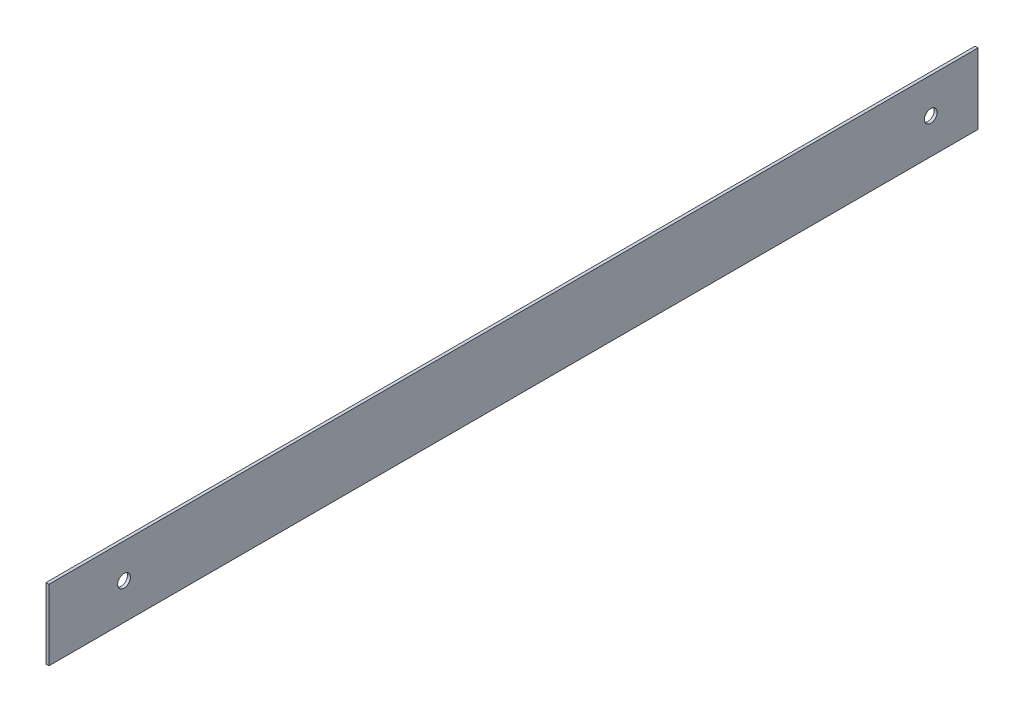
ISO-10303-21;
HEADER;
FILE_DESCRIPTION(('STEP AP214'),'2;1');
FILE_NAME('part.step','',(''),(''),'','','');
FILE_SCHEMA(('AUTOMOTIVE_DESIGN { 1 0 10303 214 1 1 1 1 }'));
ENDSEC;
DATA;
#1=APPLICATION_CONTEXT('core data for automotive mechanical design processes');
#2=APPLICATION_PROTOCOL_DEFINITION('international standard','automotive_design',2000,#1);
#3=PRODUCT_CONTEXT('',#1,'mechanical');
#4=PRODUCT('Part','Part','',(#3));
#5=PRODUCT_RELATED_PRODUCT_CATEGORY('part','',(#4));
#6=PRODUCT_DEFINITION_FORMATION('','',#4);
#7=PRODUCT_DEFINITION_CONTEXT('part definition',#1,'design');
#8=PRODUCT_DEFINITION('design','',#6,#7);
#9=PRODUCT_DEFINITION_SHAPE('','',#8);
#10=(LENGTH_UNIT() NAMED_UNIT(*) SI_UNIT(.MILLI.,.METRE.));
#11=(NAMED_UNIT(*) PLANE_ANGLE_UNIT() SI_UNIT($,.RADIAN.));
#12=(NAMED_UNIT(*) SI_UNIT($,.STERADIAN.) SOLID_ANGLE_UNIT());
#13=UNCERTAINTY_MEASURE_WITH_UNIT(LENGTH_MEASURE(1.E-05),#10,'distance_accuracy_value','');
#14=(GEOMETRIC_REPRESENTATION_CONTEXT(3) GLOBAL_UNCERTAINTY_ASSIGNED_CONTEXT((#13)) GLOBAL_UNIT_ASSIGNED_CONTEXT((#10,
#11,#12)) REPRESENTATION_CONTEXT('',''));
#15=CARTESIAN_POINT('',(0.,0.,0.));
#16=DIRECTION('',(0.,0.,1.));
#17=DIRECTION('',(1.,0.,0.));
#18=AXIS2_PLACEMENT_3D('',#15,#16,#17);
#19=CARTESIAN_POINT('',(0.,0.,0.));
#20=DIRECTION('',(1.,0.,0.));
#21=DIRECTION('',(0.,0.,-1.));
#22=AXIS2_PLACEMENT_3D('',#19,#20,#21);
#23=PLANE('',#22);
#24=CARTESIAN_POINT('',(0.,-38.0365,-949.199999996));
#25=DIRECTION('',(1.,0.,0.));
#26=DIRECTION('',(0.,0.,-1.));
#27=AXIS2_PLACEMENT_3D('',#24,#25,#26);
#28=CIRCLE('',#27,6.75951994813356);
#29=CARTESIAN_POINT('',(0.,-38.0365,-955.959519944133));
#30=VERTEX_POINT('',#29);
#31=EDGE_CURVE('E37',#30,#30,#28,.T.);
#32=ORIENTED_EDGE('',*,*,#31,.T.);
#33=EDGE_LOOP('',(#32));
#34=FACE_BOUND('',#33,.T.);
#35=CARTESIAN_POINT('',(0.,-37.1875814840421,-80.8358416603946));
#36=DIRECTION('',(1.,0.,0.));
#37=DIRECTION('',(0.,0.,-1.));
#38=AXIS2_PLACEMENT_3D('',#35,#36,#37);
#39=CIRCLE('',#38,6.75951994813356);
#40=CARTESIAN_POINT('',(0.,-37.1875814840421,-87.5953616085282));
#41=VERTEX_POINT('',#40);
#42=EDGE_CURVE('E102',#41,#41,#39,.T.);
#43=ORIENTED_EDGE('',*,*,#42,.T.);
#44=EDGE_LOOP('',(#43));
#45=FACE_BOUND('',#44,.T.);
#46=DIRECTION('',(0.,-1.,0.));
#47=VECTOR('',#46,1.);
#48=CARTESIAN_POINT('',(0.,0.,0.));
#49=LINE('',#48,#47);
#50=CARTESIAN_POINT('',(0.,0.,0.));
#51=VERTEX_POINT('',#50);
#52=CARTESIAN_POINT('',(0.,-76.073,0.));
#53=VERTEX_POINT('',#52);
#54=EDGE_CURVE('E99',#51,#53,#49,.T.);
#55=ORIENTED_EDGE('',*,*,#54,.F.);
#56=DIRECTION('',(0.,0.,1.));
#57=VECTOR('',#56,1.);
#58=CARTESIAN_POINT('',(0.,0.,0.));
#59=LINE('',#58,#57);
#60=CARTESIAN_POINT('',(0.,0.,-999.999999996));
#61=VERTEX_POINT('',#60);
#62=EDGE_CURVE('E74',#61,#51,#59,.T.);
#63=ORIENTED_EDGE('',*,*,#62,.F.);
#64=DIRECTION('',(0.,1.,0.));
#65=VECTOR('',#64,1.);
#66=CARTESIAN_POINT('',(0.,0.,-999.999999996));
#67=LINE('',#66,#65);
#68=CARTESIAN_POINT('',(0.,-76.073,-999.999999996));
#69=VERTEX_POINT('',#68);
#70=EDGE_CURVE('E68',#69,#61,#67,.T.);
#71=ORIENTED_EDGE('',*,*,#70,.F.);
#72=DIRECTION('',(0.,0.,-1.));
#73=VECTOR('',#72,1.);
#74=CARTESIAN_POINT('',(0.,-76.073,0.));
#75=LINE('',#74,#73);
#76=EDGE_CURVE('E90',#53,#69,#75,.T.);
#77=ORIENTED_EDGE('',*,*,#76,.F.);
#78=EDGE_LOOP('',(#55,#63,#71,#77));
#79=FACE_BOUND('',#78,.T.);
#80=ADVANCED_FACE('F33',(#34,#45,#79),#23,.F.);
#81=CARTESIAN_POINT('',(3.175,0.,0.));
#82=DIRECTION('',(0.,0.,-1.));
#83=DIRECTION('',(0.,1.,0.));
#84=AXIS2_PLACEMENT_3D('',#81,#82,#83);
#85=PLANE('',#84);
#86=ORIENTED_EDGE('',*,*,#54,.T.);
#87=DIRECTION('',(-1.,0.,0.));
#88=VECTOR('',#87,1.);
#89=CARTESIAN_POINT('',(3.175,-76.073,0.));
#90=LINE('',#89,#88);
#91=CARTESIAN_POINT('',(3.175,-76.073,0.));
#92=VERTEX_POINT('',#91);
#93=EDGE_CURVE('E11',#92,#53,#90,.T.);
#94=ORIENTED_EDGE('',*,*,#93,.F.);
#95=DIRECTION('',(0.,-1.,0.));
#96=VECTOR('',#95,1.);
#97=CARTESIAN_POINT('',(3.175,0.,0.));
#98=LINE('',#97,#96);
#99=CARTESIAN_POINT('',(3.175,0.,0.));
#100=VERTEX_POINT('',#99);
#101=EDGE_CURVE('E86',#100,#92,#98,.T.);
#102=ORIENTED_EDGE('',*,*,#101,.F.);
#103=DIRECTION('',(-1.,0.,0.));
#104=VECTOR('',#103,1.);
#105=CARTESIAN_POINT('',(3.175,0.,0.));
#106=LINE('',#105,#104);
#107=EDGE_CURVE('E95',#100,#51,#106,.T.);
#108=ORIENTED_EDGE('',*,*,#107,.T.);
#109=EDGE_LOOP('',(#86,#94,#102,#108));
#110=FACE_BOUND('',#109,.T.);
#111=ADVANCED_FACE('F35',(#110),#85,.F.);
#112=CARTESIAN_POINT('',(3.175,-76.073,0.));
#113=DIRECTION('',(0.,1.,0.));
#114=DIRECTION('',(0.,0.,1.));
#115=AXIS2_PLACEMENT_3D('',#112,#113,#114);
#116=PLANE('',#115);
#117=ORIENTED_EDGE('',*,*,#76,.T.);
#118=DIRECTION('',(-1.,0.,0.));
#119=VECTOR('',#118,1.);
#120=CARTESIAN_POINT('',(3.175,-76.073,-999.999999996));
#121=LINE('',#120,#119);
#122=CARTESIAN_POINT('',(3.175,-76.073,-999.999999996));
#123=VERTEX_POINT('',#122);
#124=EDGE_CURVE('E43',#123,#69,#121,.T.);
#125=ORIENTED_EDGE('',*,*,#124,.F.);
#126=DIRECTION('',(0.,0.,-1.));
#127=VECTOR('',#126,1.);
#128=CARTESIAN_POINT('',(3.175,-76.073,0.));
#129=LINE('',#128,#127);
#130=EDGE_CURVE('E81',#92,#123,#129,.T.);
#131=ORIENTED_EDGE('',*,*,#130,.F.);
#132=ORIENTED_EDGE('',*,*,#93,.T.);
#133=EDGE_LOOP('',(#117,#125,#131,#132));
#134=FACE_BOUND('',#133,.T.);
#135=ADVANCED_FACE('F89',(#134),#116,.F.);
#136=CARTESIAN_POINT('',(3.175,0.,-999.999999996));
#137=DIRECTION('',(0.,0.,1.));
#138=DIRECTION('',(1.,0.,0.));
#139=AXIS2_PLACEMENT_3D('',#136,#137,#138);
#140=PLANE('',#139);
#141=ORIENTED_EDGE('',*,*,#70,.T.);
#142=DIRECTION('',(-1.,0.,0.));
#143=VECTOR('',#142,1.);
#144=CARTESIAN_POINT('',(3.175,0.,-999.999999996));
#145=LINE('',#144,#143);
#146=CARTESIAN_POINT('',(3.175,0.,-999.999999996));
#147=VERTEX_POINT('',#146);
#148=EDGE_CURVE('E91',#147,#61,#145,.T.);
#149=ORIENTED_EDGE('',*,*,#148,.F.);
#150=DIRECTION('',(0.,1.,0.));
#151=VECTOR('',#150,1.);
#152=CARTESIAN_POINT('',(3.175,0.,-999.999999996));
#153=LINE('',#152,#151);
#154=EDGE_CURVE('E84',#123,#147,#153,.T.);
#155=ORIENTED_EDGE('',*,*,#154,.F.);
#156=ORIENTED_EDGE('',*,*,#124,.T.);
#157=EDGE_LOOP('',(#141,#149,#155,#156));
#158=FACE_BOUND('',#157,.T.);
#159=ADVANCED_FACE('F93',(#158),#140,.F.);
#160=CARTESIAN_POINT('',(3.175,0.,0.));
#161=DIRECTION('',(0.,-1.,0.));
#162=DIRECTION('',(0.,0.,-1.));
#163=AXIS2_PLACEMENT_3D('',#160,#161,#162);
#164=PLANE('',#163);
#165=ORIENTED_EDGE('',*,*,#62,.T.);
#166=ORIENTED_EDGE('',*,*,#107,.F.);
#167=DIRECTION('',(0.,0.,1.));
#168=VECTOR('',#167,1.);
#169=CARTESIAN_POINT('',(3.175,0.,0.));
#170=LINE('',#169,#168);
#171=EDGE_CURVE('E51',#147,#100,#170,.T.);
#172=ORIENTED_EDGE('',*,*,#171,.F.);
#173=ORIENTED_EDGE('',*,*,#148,.T.);
#174=EDGE_LOOP('',(#165,#166,#172,#173));
#175=FACE_BOUND('',#174,.T.);
#176=ADVANCED_FACE('F107',(#175),#164,.F.);
#177=CARTESIAN_POINT('',(3.175,0.,0.));
#178=DIRECTION('',(1.,0.,0.));
#179=DIRECTION('',(0.,0.,-1.));
#180=AXIS2_PLACEMENT_3D('',#177,#178,#179);
#181=PLANE('',#180);
#182=CARTESIAN_POINT('',(3.175,-38.0365,-949.199999996));
#183=DIRECTION('',(1.,0.,0.));
#184=DIRECTION('',(0.,0.,-1.));
#185=AXIS2_PLACEMENT_3D('',#182,#183,#184);
#186=CIRCLE('',#185,6.8545837);
#187=CARTESIAN_POINT('',(3.175,-38.0365,-956.054583696));
#188=VERTEX_POINT('',#187);
#189=EDGE_CURVE('E117',#188,#188,#186,.T.);
#190=ORIENTED_EDGE('',*,*,#189,.F.);
#191=EDGE_LOOP('',(#190));
#192=FACE_BOUND('',#191,.T.);
#193=CARTESIAN_POINT('',(3.175,-37.1875814840421,-80.8358416603946));
#194=DIRECTION('',(1.,0.,0.));
#195=DIRECTION('',(0.,0.,-1.));
#196=AXIS2_PLACEMENT_3D('',#193,#194,#195);
#197=CIRCLE('',#196,6.8545837);
#198=CARTESIAN_POINT('',(3.175,-37.1875814840421,-87.6904253603946));
#199=VERTEX_POINT('',#198);
#200=EDGE_CURVE('E114',#199,#199,#197,.T.);
#201=ORIENTED_EDGE('',*,*,#200,.F.);
#202=EDGE_LOOP('',(#201));
#203=FACE_BOUND('',#202,.T.);
#204=ORIENTED_EDGE('',*,*,#101,.T.);
#205=ORIENTED_EDGE('',*,*,#130,.T.);
#206=ORIENTED_EDGE('',*,*,#154,.T.);
#207=ORIENTED_EDGE('',*,*,#171,.T.);
#208=EDGE_LOOP('',(#204,#205,#206,#207));
#209=FACE_BOUND('',#208,.T.);
#210=ADVANCED_FACE('F82',(#192,#203,#209),#181,.T.);
#211=CARTESIAN_POINT('',(3.175,-37.1875814840421,-80.8358416603946));
#212=DIRECTION('',(1.,0.,0.));
#213=DIRECTION('',(0.,0.,-1.));
#214=AXIS2_PLACEMENT_3D('',#211,#212,#213);
#215=CONICAL_SURFACE('',#214,6.8545837,0.0299323966717029);
#216=ORIENTED_EDGE('',*,*,#200,.T.);
#217=EDGE_LOOP('',(#216));
#218=FACE_BOUND('',#217,.T.);
#219=ORIENTED_EDGE('',*,*,#42,.F.);
#220=EDGE_LOOP('',(#219));
#221=FACE_BOUND('',#220,.T.);
#222=ADVANCED_FACE('F128',(#218,#221),#215,.F.);
#223=CARTESIAN_POINT('',(3.175,-38.0365,-949.199999996));
#224=DIRECTION('',(1.,0.,0.));
#225=DIRECTION('',(0.,0.,-1.));
#226=AXIS2_PLACEMENT_3D('',#223,#224,#225);
#227=CONICAL_SURFACE('',#226,6.8545837,0.0299323966717025);
#228=ORIENTED_EDGE('',*,*,#189,.T.);
#229=EDGE_LOOP('',(#228));
#230=FACE_BOUND('',#229,.T.);
#231=ORIENTED_EDGE('',*,*,#31,.F.);
#232=EDGE_LOOP('',(#231));
#233=FACE_BOUND('',#232,.T.);
#234=ADVANCED_FACE('F126',(#230,#233),#227,.F.);
#235=CLOSED_SHELL('',(#80,#111,#135,#159,#176,#210,#222,#234));
#236=MANIFOLD_SOLID_BREP('B2',#235);
#237=ADVANCED_BREP_SHAPE_REPRESENTATION('',(#18,#236),#14);
#238=SHAPE_DEFINITION_REPRESENTATION(#9,#237);
ENDSEC;
END-ISO-10303-21;
